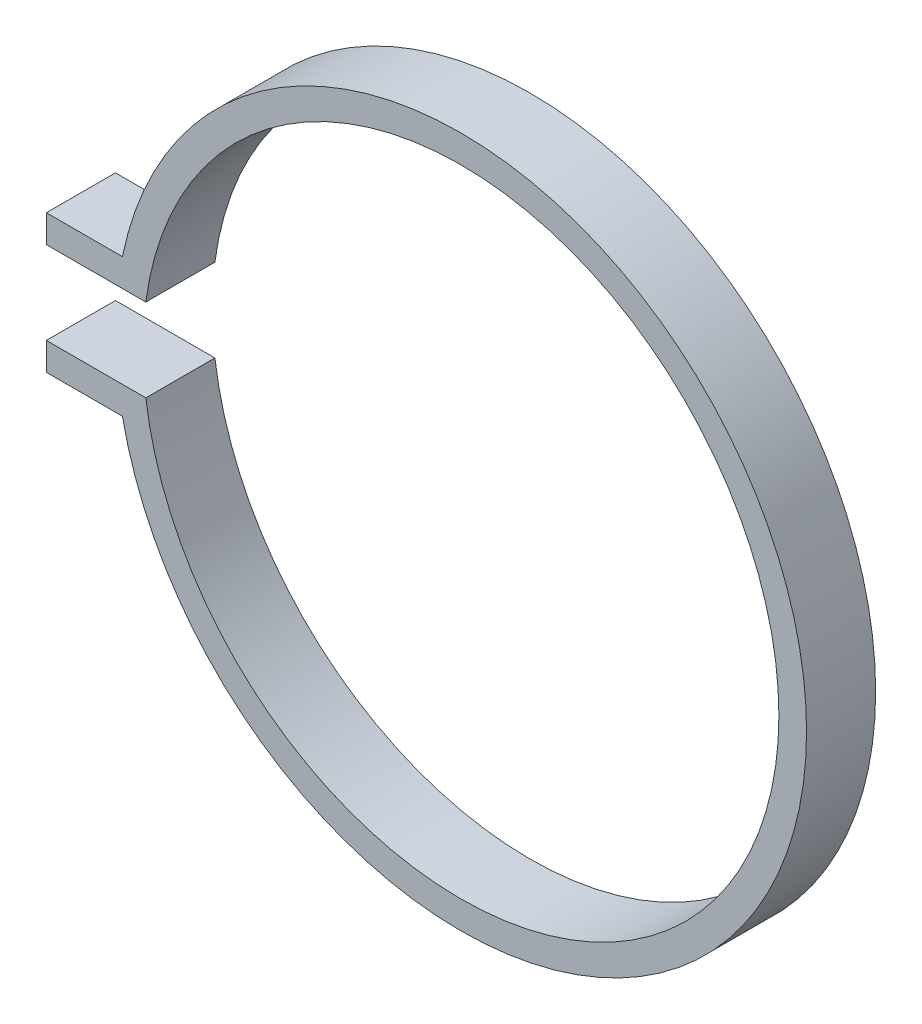
ISO-10303-21;
HEADER;
FILE_DESCRIPTION(('STEP AP214'),'2;1');
FILE_NAME('part.step','',(''),(''),'','','');
FILE_SCHEMA(('AUTOMOTIVE_DESIGN { 1 0 10303 214 1 1 1 1 }'));
ENDSEC;
DATA;
#1=APPLICATION_CONTEXT('core data for automotive mechanical design processes');
#2=APPLICATION_PROTOCOL_DEFINITION('international standard','automotive_design',2000,#1);
#3=PRODUCT_CONTEXT('',#1,'mechanical');
#4=PRODUCT('Part','Part','',(#3));
#5=PRODUCT_RELATED_PRODUCT_CATEGORY('part','',(#4));
#6=PRODUCT_DEFINITION_FORMATION('','',#4);
#7=PRODUCT_DEFINITION_CONTEXT('part definition',#1,'design');
#8=PRODUCT_DEFINITION('design','',#6,#7);
#9=PRODUCT_DEFINITION_SHAPE('','',#8);
#10=(LENGTH_UNIT() NAMED_UNIT(*) SI_UNIT(.MILLI.,.METRE.));
#11=(NAMED_UNIT(*) PLANE_ANGLE_UNIT() SI_UNIT($,.RADIAN.));
#12=(NAMED_UNIT(*) SI_UNIT($,.STERADIAN.) SOLID_ANGLE_UNIT());
#13=UNCERTAINTY_MEASURE_WITH_UNIT(LENGTH_MEASURE(1.E-05),#10,'distance_accuracy_value','');
#14=(GEOMETRIC_REPRESENTATION_CONTEXT(3) GLOBAL_UNCERTAINTY_ASSIGNED_CONTEXT((#13)) GLOBAL_UNIT_ASSIGNED_CONTEXT((#10,
#11,#12)) REPRESENTATION_CONTEXT('',''));
#15=CARTESIAN_POINT('',(0.,0.,0.));
#16=DIRECTION('',(0.,0.,1.));
#17=DIRECTION('',(1.,0.,0.));
#18=AXIS2_PLACEMENT_3D('',#15,#16,#17);
#19=CARTESIAN_POINT('',(0.,0.,10.));
#20=DIRECTION('',(0.,0.,-1.));
#21=DIRECTION('',(-1.,0.,0.));
#22=AXIS2_PLACEMENT_3D('',#19,#20,#21);
#23=CYLINDRICAL_SURFACE('',#22,50.);
#24=CARTESIAN_POINT('',(0.,0.,0.));
#25=DIRECTION('',(0.,0.,1.));
#26=DIRECTION('',(1.,0.,0.));
#27=AXIS2_PLACEMENT_3D('',#24,#25,#26);
#28=CIRCLE('',#27,50.);
#29=CARTESIAN_POINT('',(-48.9897948556636,-10.,0.));
#30=VERTEX_POINT('',#29);
#31=CARTESIAN_POINT('',(-48.9897948556636,10.,0.));
#32=VERTEX_POINT('',#31);
#33=EDGE_CURVE('E133',#30,#32,#28,.T.);
#34=ORIENTED_EDGE('',*,*,#33,.T.);
#35=DIRECTION('',(0.,0.,-1.));
#36=VECTOR('',#35,1.);
#37=CARTESIAN_POINT('',(-48.9897948556636,10.,10.));
#38=LINE('',#37,#36);
#39=CARTESIAN_POINT('',(-48.9897948556636,10.,10.));
#40=VERTEX_POINT('',#39);
#41=EDGE_CURVE('E11',#40,#32,#38,.T.);
#42=ORIENTED_EDGE('',*,*,#41,.F.);
#43=CARTESIAN_POINT('',(0.,0.,10.));
#44=DIRECTION('',(0.,0.,1.));
#45=DIRECTION('',(1.,0.,0.));
#46=AXIS2_PLACEMENT_3D('',#43,#44,#45);
#47=CIRCLE('',#46,50.);
#48=CARTESIAN_POINT('',(-48.9897948556636,-10.,10.));
#49=VERTEX_POINT('',#48);
#50=EDGE_CURVE('E147',#49,#40,#47,.T.);
#51=ORIENTED_EDGE('',*,*,#50,.F.);
#52=DIRECTION('',(0.,0.,-1.));
#53=VECTOR('',#52,1.);
#54=CARTESIAN_POINT('',(-48.9897948556636,-10.,10.));
#55=LINE('',#54,#53);
#56=EDGE_CURVE('E129',#49,#30,#55,.T.);
#57=ORIENTED_EDGE('',*,*,#56,.T.);
#58=EDGE_LOOP('',(#34,#42,#51,#57));
#59=FACE_BOUND('',#58,.T.);
#60=ADVANCED_FACE('F37',(#59),#23,.T.);
#61=CARTESIAN_POINT('',(-60.,10.,10.));
#62=DIRECTION('',(0.,-1.,0.));
#63=DIRECTION('',(0.,0.,-1.));
#64=AXIS2_PLACEMENT_3D('',#61,#62,#63);
#65=PLANE('',#64);
#66=DIRECTION('',(-1.,0.,0.));
#67=VECTOR('',#66,1.);
#68=CARTESIAN_POINT('',(-60.,10.,0.));
#69=LINE('',#68,#67);
#70=CARTESIAN_POINT('',(-60.,10.,0.));
#71=VERTEX_POINT('',#70);
#72=EDGE_CURVE('E136',#32,#71,#69,.T.);
#73=ORIENTED_EDGE('',*,*,#72,.T.);
#74=DIRECTION('',(0.,0.,-1.));
#75=VECTOR('',#74,1.);
#76=CARTESIAN_POINT('',(-60.,10.,10.));
#77=LINE('',#76,#75);
#78=CARTESIAN_POINT('',(-60.,10.,10.));
#79=VERTEX_POINT('',#78);
#80=EDGE_CURVE('E45',#79,#71,#77,.T.);
#81=ORIENTED_EDGE('',*,*,#80,.F.);
#82=DIRECTION('',(-1.,0.,0.));
#83=VECTOR('',#82,1.);
#84=CARTESIAN_POINT('',(-60.,10.,10.));
#85=LINE('',#84,#83);
#86=EDGE_CURVE('E96',#40,#79,#85,.T.);
#87=ORIENTED_EDGE('',*,*,#86,.F.);
#88=ORIENTED_EDGE('',*,*,#41,.T.);
#89=EDGE_LOOP('',(#73,#81,#87,#88));
#90=FACE_BOUND('',#89,.T.);
#91=ADVANCED_FACE('F182',(#90),#65,.F.);
#92=CARTESIAN_POINT('',(-60.,10.,10.));
#93=DIRECTION('',(1.,0.,0.));
#94=DIRECTION('',(0.,0.,-1.));
#95=AXIS2_PLACEMENT_3D('',#92,#93,#94);
#96=PLANE('',#95);
#97=DIRECTION('',(0.,-1.,0.));
#98=VECTOR('',#97,1.);
#99=CARTESIAN_POINT('',(-60.,10.,0.));
#100=LINE('',#99,#98);
#101=CARTESIAN_POINT('',(-60.,6.,0.));
#102=VERTEX_POINT('',#101);
#103=EDGE_CURVE('E138',#71,#102,#100,.T.);
#104=ORIENTED_EDGE('',*,*,#103,.T.);
#105=DIRECTION('',(0.,0.,-1.));
#106=VECTOR('',#105,1.);
#107=CARTESIAN_POINT('',(-60.,6.,10.));
#108=LINE('',#107,#106);
#109=CARTESIAN_POINT('',(-60.,6.,10.));
#110=VERTEX_POINT('',#109);
#111=EDGE_CURVE('E154',#110,#102,#108,.T.);
#112=ORIENTED_EDGE('',*,*,#111,.F.);
#113=DIRECTION('',(0.,-1.,0.));
#114=VECTOR('',#113,1.);
#115=CARTESIAN_POINT('',(-60.,10.,10.));
#116=LINE('',#115,#114);
#117=EDGE_CURVE('E162',#79,#110,#116,.T.);
#118=ORIENTED_EDGE('',*,*,#117,.F.);
#119=ORIENTED_EDGE('',*,*,#80,.T.);
#120=EDGE_LOOP('',(#104,#112,#118,#119));
#121=FACE_BOUND('',#120,.T.);
#122=ADVANCED_FACE('F160',(#121),#96,.F.);
#123=CARTESIAN_POINT('',(-60.,6.,10.));
#124=DIRECTION('',(0.,1.,0.));
#125=DIRECTION('',(0.,0.,1.));
#126=AXIS2_PLACEMENT_3D('',#123,#124,#125);
#127=PLANE('',#126);
#128=DIRECTION('',(1.,0.,0.));
#129=VECTOR('',#128,1.);
#130=CARTESIAN_POINT('',(-60.,6.,0.));
#131=LINE('',#130,#129);
#132=CARTESIAN_POINT('',(-45.6070170039655,6.00000000000003,0.));
#133=VERTEX_POINT('',#132);
#134=EDGE_CURVE('E140',#102,#133,#131,.T.);
#135=ORIENTED_EDGE('',*,*,#134,.T.);
#136=DIRECTION('',(0.,0.,-1.));
#137=VECTOR('',#136,1.);
#138=CARTESIAN_POINT('',(-45.6070170039655,6.00000000000003,10.));
#139=LINE('',#138,#137);
#140=CARTESIAN_POINT('',(-45.6070170039655,6.00000000000003,10.));
#141=VERTEX_POINT('',#140);
#142=EDGE_CURVE('E151',#141,#133,#139,.T.);
#143=ORIENTED_EDGE('',*,*,#142,.F.);
#144=DIRECTION('',(1.,0.,0.));
#145=VECTOR('',#144,1.);
#146=CARTESIAN_POINT('',(-60.,6.,10.));
#147=LINE('',#146,#145);
#148=EDGE_CURVE('E174',#110,#141,#147,.T.);
#149=ORIENTED_EDGE('',*,*,#148,.F.);
#150=ORIENTED_EDGE('',*,*,#111,.T.);
#151=EDGE_LOOP('',(#135,#143,#149,#150));
#152=FACE_BOUND('',#151,.T.);
#153=ADVANCED_FACE('F170',(#152),#127,.F.);
#154=CARTESIAN_POINT('',(0.,0.,10.));
#155=DIRECTION('',(0.,0.,-1.));
#156=DIRECTION('',(-1.,0.,0.));
#157=AXIS2_PLACEMENT_3D('',#154,#155,#156);
#158=CYLINDRICAL_SURFACE('',#157,46.);
#159=CARTESIAN_POINT('',(0.,0.,0.));
#160=DIRECTION('',(0.,0.,-1.));
#161=DIRECTION('',(1.,0.,0.));
#162=AXIS2_PLACEMENT_3D('',#159,#160,#161);
#163=CIRCLE('',#162,46.);
#164=CARTESIAN_POINT('',(-45.6070170039655,-6.,0.));
#165=VERTEX_POINT('',#164);
#166=EDGE_CURVE('E142',#133,#165,#163,.T.);
#167=ORIENTED_EDGE('',*,*,#166,.T.);
#168=DIRECTION('',(0.,0.,-1.));
#169=VECTOR('',#168,1.);
#170=CARTESIAN_POINT('',(-45.6070170039655,-6.,10.));
#171=LINE('',#170,#169);
#172=CARTESIAN_POINT('',(-45.6070170039655,-6.,10.));
#173=VERTEX_POINT('',#172);
#174=EDGE_CURVE('E124',#173,#165,#171,.T.);
#175=ORIENTED_EDGE('',*,*,#174,.F.);
#176=CARTESIAN_POINT('',(0.,0.,10.));
#177=DIRECTION('',(0.,0.,-1.));
#178=DIRECTION('',(1.,0.,0.));
#179=AXIS2_PLACEMENT_3D('',#176,#177,#178);
#180=CIRCLE('',#179,46.);
#181=EDGE_CURVE('E115',#141,#173,#180,.T.);
#182=ORIENTED_EDGE('',*,*,#181,.F.);
#183=ORIENTED_EDGE('',*,*,#142,.T.);
#184=EDGE_LOOP('',(#167,#175,#182,#183));
#185=FACE_BOUND('',#184,.T.);
#186=ADVANCED_FACE('F173',(#185),#158,.F.);
#187=CARTESIAN_POINT('',(-60.,-6.,10.));
#188=DIRECTION('',(0.,-1.,0.));
#189=DIRECTION('',(0.,0.,-1.));
#190=AXIS2_PLACEMENT_3D('',#187,#188,#189);
#191=PLANE('',#190);
#192=DIRECTION('',(-1.,0.,0.));
#193=VECTOR('',#192,1.);
#194=CARTESIAN_POINT('',(-60.,-6.,0.));
#195=LINE('',#194,#193);
#196=CARTESIAN_POINT('',(-60.,-6.,0.));
#197=VERTEX_POINT('',#196);
#198=EDGE_CURVE('E123',#165,#197,#195,.T.);
#199=ORIENTED_EDGE('',*,*,#198,.T.);
#200=DIRECTION('',(0.,0.,-1.));
#201=VECTOR('',#200,1.);
#202=CARTESIAN_POINT('',(-60.,-6.,10.));
#203=LINE('',#202,#201);
#204=CARTESIAN_POINT('',(-60.,-6.,10.));
#205=VERTEX_POINT('',#204);
#206=EDGE_CURVE('E120',#205,#197,#203,.T.);
#207=ORIENTED_EDGE('',*,*,#206,.F.);
#208=DIRECTION('',(-1.,0.,0.));
#209=VECTOR('',#208,1.);
#210=CARTESIAN_POINT('',(-60.,-6.,10.));
#211=LINE('',#210,#209);
#212=EDGE_CURVE('E109',#173,#205,#211,.T.);
#213=ORIENTED_EDGE('',*,*,#212,.F.);
#214=ORIENTED_EDGE('',*,*,#174,.T.);
#215=EDGE_LOOP('',(#199,#207,#213,#214));
#216=FACE_BOUND('',#215,.T.);
#217=ADVANCED_FACE('F121',(#216),#191,.F.);
#218=CARTESIAN_POINT('',(-60.,-6.,10.));
#219=DIRECTION('',(1.,0.,0.));
#220=DIRECTION('',(0.,0.,-1.));
#221=AXIS2_PLACEMENT_3D('',#218,#219,#220);
#222=PLANE('',#221);
#223=DIRECTION('',(0.,-1.,0.));
#224=VECTOR('',#223,1.);
#225=CARTESIAN_POINT('',(-60.,-6.,0.));
#226=LINE('',#225,#224);
#227=CARTESIAN_POINT('',(-60.,-10.,0.));
#228=VERTEX_POINT('',#227);
#229=EDGE_CURVE('E82',#197,#228,#226,.T.);
#230=ORIENTED_EDGE('',*,*,#229,.T.);
#231=DIRECTION('',(0.,0.,-1.));
#232=VECTOR('',#231,1.);
#233=CARTESIAN_POINT('',(-60.,-10.,10.));
#234=LINE('',#233,#232);
#235=CARTESIAN_POINT('',(-60.,-10.,10.));
#236=VERTEX_POINT('',#235);
#237=EDGE_CURVE('E125',#236,#228,#234,.T.);
#238=ORIENTED_EDGE('',*,*,#237,.F.);
#239=DIRECTION('',(0.,-1.,0.));
#240=VECTOR('',#239,1.);
#241=CARTESIAN_POINT('',(-60.,-6.,10.));
#242=LINE('',#241,#240);
#243=EDGE_CURVE('E113',#205,#236,#242,.T.);
#244=ORIENTED_EDGE('',*,*,#243,.F.);
#245=ORIENTED_EDGE('',*,*,#206,.T.);
#246=EDGE_LOOP('',(#230,#238,#244,#245));
#247=FACE_BOUND('',#246,.T.);
#248=ADVANCED_FACE('F127',(#247),#222,.F.);
#249=CARTESIAN_POINT('',(-60.,-10.,10.));
#250=DIRECTION('',(0.,1.,0.));
#251=DIRECTION('',(0.,0.,1.));
#252=AXIS2_PLACEMENT_3D('',#249,#250,#251);
#253=PLANE('',#252);
#254=DIRECTION('',(1.,0.,0.));
#255=VECTOR('',#254,1.);
#256=CARTESIAN_POINT('',(-60.,-10.,0.));
#257=LINE('',#256,#255);
#258=EDGE_CURVE('E88',#228,#30,#257,.T.);
#259=ORIENTED_EDGE('',*,*,#258,.T.);
#260=ORIENTED_EDGE('',*,*,#56,.F.);
#261=DIRECTION('',(1.,0.,0.));
#262=VECTOR('',#261,1.);
#263=CARTESIAN_POINT('',(-60.,-10.,10.));
#264=LINE('',#263,#262);
#265=EDGE_CURVE('E53',#236,#49,#264,.T.);
#266=ORIENTED_EDGE('',*,*,#265,.F.);
#267=ORIENTED_EDGE('',*,*,#237,.T.);
#268=EDGE_LOOP('',(#259,#260,#266,#267));
#269=FACE_BOUND('',#268,.T.);
#270=ADVANCED_FACE('F198',(#269),#253,.F.);
#271=CARTESIAN_POINT('',(0.,0.,10.));
#272=DIRECTION('',(0.,0.,1.));
#273=DIRECTION('',(1.,0.,0.));
#274=AXIS2_PLACEMENT_3D('',#271,#272,#273);
#275=PLANE('',#274);
#276=ORIENTED_EDGE('',*,*,#50,.T.);
#277=ORIENTED_EDGE('',*,*,#86,.T.);
#278=ORIENTED_EDGE('',*,*,#117,.T.);
#279=ORIENTED_EDGE('',*,*,#148,.T.);
#280=ORIENTED_EDGE('',*,*,#181,.T.);
#281=ORIENTED_EDGE('',*,*,#212,.T.);
#282=ORIENTED_EDGE('',*,*,#243,.T.);
#283=ORIENTED_EDGE('',*,*,#265,.T.);
#284=EDGE_LOOP('',(#276,#277,#278,#279,#280,#281,#282,#283));
#285=FACE_BOUND('',#284,.T.);
#286=ADVANCED_FACE('F111',(#285),#275,.T.);
#287=CARTESIAN_POINT('',(0.,0.,0.));
#288=DIRECTION('',(0.,0.,1.));
#289=DIRECTION('',(1.,0.,0.));
#290=AXIS2_PLACEMENT_3D('',#287,#288,#289);
#291=PLANE('',#290);
#292=ORIENTED_EDGE('',*,*,#33,.F.);
#293=ORIENTED_EDGE('',*,*,#258,.F.);
#294=ORIENTED_EDGE('',*,*,#229,.F.);
#295=ORIENTED_EDGE('',*,*,#198,.F.);
#296=ORIENTED_EDGE('',*,*,#166,.F.);
#297=ORIENTED_EDGE('',*,*,#134,.F.);
#298=ORIENTED_EDGE('',*,*,#103,.F.);
#299=ORIENTED_EDGE('',*,*,#72,.F.);
#300=EDGE_LOOP('',(#292,#293,#294,#295,#296,#297,#298,#299));
#301=FACE_BOUND('',#300,.T.);
#302=ADVANCED_FACE('F166',(#301),#291,.F.);
#303=CLOSED_SHELL('',(#60,#91,#122,#153,#186,#217,#248,#270,#286,#302));
#304=MANIFOLD_SOLID_BREP('B2',#303);
#305=ADVANCED_BREP_SHAPE_REPRESENTATION('',(#18,#304),#14);
#306=SHAPE_DEFINITION_REPRESENTATION(#9,#305);
ENDSEC;
END-ISO-10303-21;
